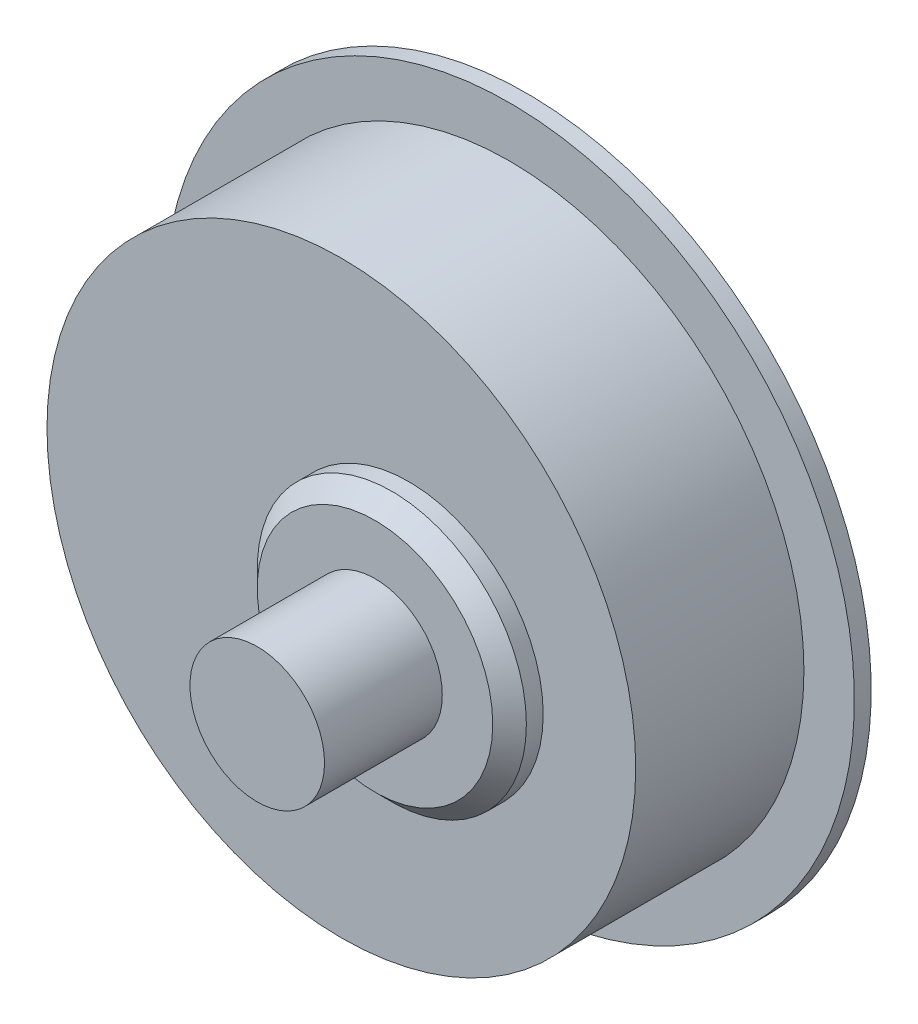
ISO-10303-21;
HEADER;
FILE_DESCRIPTION(('STEP AP214'),'2;1');
FILE_NAME('part.step','',(''),(''),'','','');
FILE_SCHEMA(('AUTOMOTIVE_DESIGN { 1 0 10303 214 1 1 1 1 }'));
ENDSEC;
DATA;
#1=APPLICATION_CONTEXT('core data for automotive mechanical design processes');
#2=APPLICATION_PROTOCOL_DEFINITION('international standard','automotive_design',2000,#1);
#3=PRODUCT_CONTEXT('',#1,'mechanical');
#4=PRODUCT('Part','Part','',(#3));
#5=PRODUCT_RELATED_PRODUCT_CATEGORY('part','',(#4));
#6=PRODUCT_DEFINITION_FORMATION('','',#4);
#7=PRODUCT_DEFINITION_CONTEXT('part definition',#1,'design');
#8=PRODUCT_DEFINITION('design','',#6,#7);
#9=PRODUCT_DEFINITION_SHAPE('','',#8);
#10=(LENGTH_UNIT() NAMED_UNIT(*) SI_UNIT(.MILLI.,.METRE.));
#11=(NAMED_UNIT(*) PLANE_ANGLE_UNIT() SI_UNIT($,.RADIAN.));
#12=(NAMED_UNIT(*) SI_UNIT($,.STERADIAN.) SOLID_ANGLE_UNIT());
#13=UNCERTAINTY_MEASURE_WITH_UNIT(LENGTH_MEASURE(1.E-05),#10,'distance_accuracy_value','');
#14=(GEOMETRIC_REPRESENTATION_CONTEXT(3) GLOBAL_UNCERTAINTY_ASSIGNED_CONTEXT((#13)) GLOBAL_UNIT_ASSIGNED_CONTEXT((#10,
#11,#12)) REPRESENTATION_CONTEXT('',''));
#15=CARTESIAN_POINT('',(0.,0.,0.));
#16=DIRECTION('',(0.,0.,1.));
#17=DIRECTION('',(1.,0.,0.));
#18=AXIS2_PLACEMENT_3D('',#15,#16,#17);
#19=CARTESIAN_POINT('',(0.,0.,5.));
#20=DIRECTION('',(0.,0.,-1.));
#21=DIRECTION('',(-1.,0.,0.));
#22=AXIS2_PLACEMENT_3D('',#19,#20,#21);
#23=CYLINDRICAL_SURFACE('',#22,4.);
#24=DIRECTION('',(0.,0.,-1.));
#25=VECTOR('',#24,1.);
#26=CARTESIAN_POINT('',(1.5,-3.70809924354783,5.));
#27=LINE('',#26,#25);
#28=CARTESIAN_POINT('',(1.5,-3.70809924354783,5.));
#29=VERTEX_POINT('',#28);
#30=CARTESIAN_POINT('',(1.5,-3.70809924354783,-6.5));
#31=VERTEX_POINT('',#30);
#32=EDGE_CURVE('E66',#29,#31,#27,.T.);
#33=ORIENTED_EDGE('',*,*,#32,.T.);
#34=CARTESIAN_POINT('',(0.,0.,-6.5));
#35=DIRECTION('',(0.,0.,-1.));
#36=DIRECTION('',(-1.,0.,0.));
#37=AXIS2_PLACEMENT_3D('',#34,#35,#36);
#38=CIRCLE('',#37,4.);
#39=CARTESIAN_POINT('',(1.5,3.70809924354783,-6.5));
#40=VERTEX_POINT('',#39);
#41=EDGE_CURVE('E101',#40,#31,#38,.F.);
#42=ORIENTED_EDGE('',*,*,#41,.F.);
#43=DIRECTION('',(0.,0.,-1.));
#44=VECTOR('',#43,1.);
#45=CARTESIAN_POINT('',(1.5,3.70809924354783,5.));
#46=LINE('',#45,#44);
#47=CARTESIAN_POINT('',(1.5,3.70809924354783,5.));
#48=VERTEX_POINT('',#47);
#49=EDGE_CURVE('E53',#48,#40,#46,.T.);
#50=ORIENTED_EDGE('',*,*,#49,.F.);
#51=CARTESIAN_POINT('',(0.,0.,5.));
#52=DIRECTION('',(0.,0.,1.));
#53=DIRECTION('',(1.,0.,0.));
#54=AXIS2_PLACEMENT_3D('',#51,#52,#53);
#55=CIRCLE('',#54,4.);
#56=EDGE_CURVE('E64',#48,#29,#55,.T.);
#57=ORIENTED_EDGE('',*,*,#56,.T.);
#58=EDGE_LOOP('',(#33,#42,#50,#57));
#59=FACE_BOUND('',#58,.T.);
#60=ADVANCED_FACE('F37',(#59),#23,.F.);
#61=CARTESIAN_POINT('',(1.5,0.,5.));
#62=DIRECTION('',(1.,0.,0.));
#63=DIRECTION('',(0.,0.,-1.));
#64=AXIS2_PLACEMENT_3D('',#61,#62,#63);
#65=PLANE('',#64);
#66=ORIENTED_EDGE('',*,*,#49,.T.);
#67=DIRECTION('',(0.,1.,0.));
#68=VECTOR('',#67,1.);
#69=CARTESIAN_POINT('',(1.5,0.,-6.5));
#70=LINE('',#69,#68);
#71=EDGE_CURVE('E73',#31,#40,#70,.T.);
#72=ORIENTED_EDGE('',*,*,#71,.F.);
#73=ORIENTED_EDGE('',*,*,#32,.F.);
#74=DIRECTION('',(0.,-1.,0.));
#75=VECTOR('',#74,1.);
#76=CARTESIAN_POINT('',(1.5,0.,5.));
#77=LINE('',#76,#75);
#78=EDGE_CURVE('E69',#48,#29,#77,.T.);
#79=ORIENTED_EDGE('',*,*,#78,.F.);
#80=EDGE_LOOP('',(#66,#72,#73,#79));
#81=FACE_BOUND('',#80,.T.);
#82=ADVANCED_FACE('F72',(#81),#65,.F.);
#83=CARTESIAN_POINT('',(-4.,0.,5.));
#84=DIRECTION('',(0.,0.,-1.));
#85=DIRECTION('',(-1.,0.,0.));
#86=AXIS2_PLACEMENT_3D('',#83,#84,#85);
#87=CYLINDRICAL_SURFACE('',#86,17.5);
#88=CARTESIAN_POINT('',(-4.,0.,5.));
#89=DIRECTION('',(0.,0.,1.));
#90=DIRECTION('',(1.,0.,0.));
#91=AXIS2_PLACEMENT_3D('',#88,#89,#90);
#92=CIRCLE('',#91,17.5);
#93=CARTESIAN_POINT('',(13.5,0.,5.));
#94=VERTEX_POINT('',#93);
#95=EDGE_CURVE('E75',#94,#94,#92,.T.);
#96=ORIENTED_EDGE('',*,*,#95,.F.);
#97=EDGE_LOOP('',(#96));
#98=FACE_BOUND('',#97,.T.);
#99=CARTESIAN_POINT('',(-4.,0.,-5.));
#100=DIRECTION('',(0.,0.,1.));
#101=DIRECTION('',(1.,0.,0.));
#102=AXIS2_PLACEMENT_3D('',#99,#100,#101);
#103=CIRCLE('',#102,17.5);
#104=CARTESIAN_POINT('',(13.5,0.,-5.));
#105=VERTEX_POINT('',#104);
#106=EDGE_CURVE('E70',#105,#105,#103,.T.);
#107=ORIENTED_EDGE('',*,*,#106,.T.);
#108=EDGE_LOOP('',(#107));
#109=FACE_BOUND('',#108,.T.);
#110=ADVANCED_FACE('F138',(#98,#109),#87,.T.);
#111=CARTESIAN_POINT('',(0.,0.,5.));
#112=DIRECTION('',(0.,0.,1.));
#113=DIRECTION('',(1.,0.,0.));
#114=AXIS2_PLACEMENT_3D('',#111,#112,#113);
#115=PLANE('',#114);
#116=CARTESIAN_POINT('',(0.,0.,5.));
#117=DIRECTION('',(0.,0.,1.));
#118=DIRECTION('',(1.,0.,0.));
#119=AXIS2_PLACEMENT_3D('',#116,#117,#118);
#120=CIRCLE('',#119,8.);
#121=CARTESIAN_POINT('',(8.,0.,5.));
#122=VERTEX_POINT('',#121);
#123=EDGE_CURVE('E97',#122,#122,#120,.T.);
#124=ORIENTED_EDGE('',*,*,#123,.F.);
#125=EDGE_LOOP('',(#124));
#126=FACE_BOUND('',#125,.T.);
#127=ORIENTED_EDGE('',*,*,#95,.T.);
#128=EDGE_LOOP('',(#127));
#129=FACE_BOUND('',#128,.T.);
#130=ADVANCED_FACE('F143',(#126,#129),#115,.T.);
#131=CARTESIAN_POINT('',(-4.,0.,-6.));
#132=DIRECTION('',(0.,0.,1.));
#133=DIRECTION('',(1.,0.,0.));
#134=AXIS2_PLACEMENT_3D('',#131,#132,#133);
#135=CYLINDRICAL_SURFACE('',#134,20.5);
#136=CARTESIAN_POINT('',(-4.,0.,-6.));
#137=DIRECTION('',(0.,0.,-1.));
#138=DIRECTION('',(-1.,0.,0.));
#139=AXIS2_PLACEMENT_3D('',#136,#137,#138);
#140=CIRCLE('',#139,20.5);
#141=CARTESIAN_POINT('',(-24.5,0.,-6.));
#142=VERTEX_POINT('',#141);
#143=EDGE_CURVE('E84',#142,#142,#140,.T.);
#144=ORIENTED_EDGE('',*,*,#143,.F.);
#145=EDGE_LOOP('',(#144));
#146=FACE_BOUND('',#145,.T.);
#147=CARTESIAN_POINT('',(-4.,0.,-5.));
#148=DIRECTION('',(0.,0.,-1.));
#149=DIRECTION('',(-1.,0.,0.));
#150=AXIS2_PLACEMENT_3D('',#147,#148,#149);
#151=CIRCLE('',#150,20.5);
#152=CARTESIAN_POINT('',(-24.5,0.,-5.));
#153=VERTEX_POINT('',#152);
#154=EDGE_CURVE('E107',#153,#153,#151,.T.);
#155=ORIENTED_EDGE('',*,*,#154,.T.);
#156=EDGE_LOOP('',(#155));
#157=FACE_BOUND('',#156,.T.);
#158=ADVANCED_FACE('F114',(#146,#157),#135,.T.);
#159=CARTESIAN_POINT('',(0.,0.,-6.));
#160=DIRECTION('',(0.,0.,-1.));
#161=DIRECTION('',(-1.,0.,0.));
#162=AXIS2_PLACEMENT_3D('',#159,#160,#161);
#163=PLANE('',#162);
#164=CARTESIAN_POINT('',(0.,0.,-6.));
#165=DIRECTION('',(0.,0.,-1.));
#166=DIRECTION('',(-1.,0.,0.));
#167=AXIS2_PLACEMENT_3D('',#164,#165,#166);
#168=CIRCLE('',#167,7.5);
#169=CARTESIAN_POINT('',(-7.5,0.,-6.));
#170=VERTEX_POINT('',#169);
#171=EDGE_CURVE('E100',#170,#170,#168,.T.);
#172=ORIENTED_EDGE('',*,*,#171,.F.);
#173=EDGE_LOOP('',(#172));
#174=FACE_BOUND('',#173,.T.);
#175=ORIENTED_EDGE('',*,*,#143,.T.);
#176=EDGE_LOOP('',(#175));
#177=FACE_BOUND('',#176,.T.);
#178=ADVANCED_FACE('F119',(#174,#177),#163,.T.);
#179=CARTESIAN_POINT('',(0.,0.,-5.));
#180=DIRECTION('',(0.,0.,-1.));
#181=DIRECTION('',(-1.,0.,0.));
#182=AXIS2_PLACEMENT_3D('',#179,#180,#181);
#183=PLANE('',#182);
#184=ORIENTED_EDGE('',*,*,#106,.F.);
#185=EDGE_LOOP('',(#184));
#186=FACE_BOUND('',#185,.T.);
#187=ORIENTED_EDGE('',*,*,#154,.F.);
#188=EDGE_LOOP('',(#187));
#189=FACE_BOUND('',#188,.T.);
#190=ADVANCED_FACE('F116',(#186,#189),#183,.F.);
#191=CARTESIAN_POINT('',(0.,0.,-6.5));
#192=DIRECTION('',(0.,0.,1.));
#193=DIRECTION('',(1.,0.,0.));
#194=AXIS2_PLACEMENT_3D('',#191,#192,#193);
#195=CYLINDRICAL_SURFACE('',#194,7.5);
#196=CARTESIAN_POINT('',(0.,0.,-6.5));
#197=DIRECTION('',(0.,0.,-1.));
#198=DIRECTION('',(-1.,0.,0.));
#199=AXIS2_PLACEMENT_3D('',#196,#197,#198);
#200=CIRCLE('',#199,7.5);
#201=CARTESIAN_POINT('',(-7.5,0.,-6.5));
#202=VERTEX_POINT('',#201);
#203=EDGE_CURVE('E104',#202,#202,#200,.T.);
#204=ORIENTED_EDGE('',*,*,#203,.F.);
#205=EDGE_LOOP('',(#204));
#206=FACE_BOUND('',#205,.T.);
#207=ORIENTED_EDGE('',*,*,#171,.T.);
#208=EDGE_LOOP('',(#207));
#209=FACE_BOUND('',#208,.T.);
#210=ADVANCED_FACE('F118',(#206,#209),#195,.T.);
#211=CARTESIAN_POINT('',(0.,0.,-6.5));
#212=DIRECTION('',(0.,0.,-1.));
#213=DIRECTION('',(-1.,0.,0.));
#214=AXIS2_PLACEMENT_3D('',#211,#212,#213);
#215=PLANE('',#214);
#216=ORIENTED_EDGE('',*,*,#41,.T.);
#217=ORIENTED_EDGE('',*,*,#71,.T.);
#218=EDGE_LOOP('',(#216,#217));
#219=FACE_BOUND('',#218,.T.);
#220=ORIENTED_EDGE('',*,*,#203,.T.);
#221=EDGE_LOOP('',(#220));
#222=FACE_BOUND('',#221,.T.);
#223=ADVANCED_FACE('F126',(#219,#222),#215,.T.);
#224=CARTESIAN_POINT('',(0.,0.,7.));
#225=DIRECTION('',(0.,0.,1.));
#226=DIRECTION('',(1.,0.,0.));
#227=AXIS2_PLACEMENT_3D('',#224,#225,#226);
#228=PLANE('',#227);
#229=CARTESIAN_POINT('',(0.,0.,7.));
#230=DIRECTION('',(0.,0.,1.));
#231=DIRECTION('',(1.,0.,0.));
#232=AXIS2_PLACEMENT_3D('',#229,#230,#231);
#233=CIRCLE('',#232,6.99999999999999);
#234=CARTESIAN_POINT('',(6.99999999999999,0.,7.));
#235=VERTEX_POINT('',#234);
#236=EDGE_CURVE('E46',#235,#235,#233,.T.);
#237=ORIENTED_EDGE('',*,*,#236,.T.);
#238=EDGE_LOOP('',(#237));
#239=FACE_BOUND('',#238,.T.);
#240=CARTESIAN_POINT('',(0.,0.,7.));
#241=DIRECTION('',(0.,0.,1.));
#242=DIRECTION('',(1.,0.,0.));
#243=AXIS2_PLACEMENT_3D('',#240,#241,#242);
#244=CIRCLE('',#243,4.);
#245=CARTESIAN_POINT('',(4.,0.,7.));
#246=VERTEX_POINT('',#245);
#247=EDGE_CURVE('E86',#246,#246,#244,.T.);
#248=ORIENTED_EDGE('',*,*,#247,.F.);
#249=EDGE_LOOP('',(#248));
#250=FACE_BOUND('',#249,.T.);
#251=ADVANCED_FACE('F178',(#239,#250),#228,.T.);
#252=CARTESIAN_POINT('',(0.,0.,7.));
#253=DIRECTION('',(0.,0.,-1.));
#254=DIRECTION('',(-1.,0.,0.));
#255=AXIS2_PLACEMENT_3D('',#252,#253,#254);
#256=CYLINDRICAL_SURFACE('',#255,8.);
#257=CARTESIAN_POINT('',(0.,0.,5.99999999999999));
#258=DIRECTION('',(0.,0.,1.));
#259=DIRECTION('',(1.,0.,0.));
#260=AXIS2_PLACEMENT_3D('',#257,#258,#259);
#261=CIRCLE('',#260,8.);
#262=CARTESIAN_POINT('',(8.,0.,5.99999999999999));
#263=VERTEX_POINT('',#262);
#264=EDGE_CURVE('E11',#263,#263,#261,.F.);
#265=ORIENTED_EDGE('',*,*,#264,.T.);
#266=EDGE_LOOP('',(#265));
#267=FACE_BOUND('',#266,.T.);
#268=ORIENTED_EDGE('',*,*,#123,.T.);
#269=EDGE_LOOP('',(#268));
#270=FACE_BOUND('',#269,.T.);
#271=ADVANCED_FACE('F189',(#267,#270),#256,.T.);
#272=CARTESIAN_POINT('',(0.,0.,5.));
#273=DIRECTION('',(0.,0.,1.));
#274=DIRECTION('',(1.,0.,0.));
#275=AXIS2_PLACEMENT_3D('',#272,#273,#274);
#276=PLANE('',#275);
#277=ORIENTED_EDGE('',*,*,#56,.F.);
#278=ORIENTED_EDGE('',*,*,#78,.T.);
#279=EDGE_LOOP('',(#277,#278));
#280=FACE_BOUND('',#279,.T.);
#281=ADVANCED_FACE('F77',(#280),#276,.F.);
#282=CARTESIAN_POINT('',(0.,0.,14.));
#283=DIRECTION('',(0.,0.,-1.));
#284=DIRECTION('',(-1.,0.,0.));
#285=AXIS2_PLACEMENT_3D('',#282,#283,#284);
#286=CYLINDRICAL_SURFACE('',#285,4.);
#287=CARTESIAN_POINT('',(0.,0.,14.));
#288=DIRECTION('',(0.,0.,1.));
#289=DIRECTION('',(1.,0.,0.));
#290=AXIS2_PLACEMENT_3D('',#287,#288,#289);
#291=CIRCLE('',#290,4.);
#292=CARTESIAN_POINT('',(4.,0.,14.));
#293=VERTEX_POINT('',#292);
#294=EDGE_CURVE('E96',#293,#293,#291,.T.);
#295=ORIENTED_EDGE('',*,*,#294,.F.);
#296=EDGE_LOOP('',(#295));
#297=FACE_BOUND('',#296,.T.);
#298=ORIENTED_EDGE('',*,*,#247,.T.);
#299=EDGE_LOOP('',(#298));
#300=FACE_BOUND('',#299,.T.);
#301=ADVANCED_FACE('F204',(#297,#300),#286,.T.);
#302=CARTESIAN_POINT('',(0.,0.,14.));
#303=DIRECTION('',(0.,0.,1.));
#304=DIRECTION('',(1.,0.,0.));
#305=AXIS2_PLACEMENT_3D('',#302,#303,#304);
#306=PLANE('',#305);
#307=ORIENTED_EDGE('',*,*,#294,.T.);
#308=EDGE_LOOP('',(#307));
#309=FACE_BOUND('',#308,.T.);
#310=ADVANCED_FACE('F211',(#309),#306,.T.);
#311=CARTESIAN_POINT('',(0.,0.,7.));
#312=DIRECTION('',(0.,0.,-1.));
#313=DIRECTION('',(-1.,0.,0.));
#314=AXIS2_PLACEMENT_3D('',#311,#312,#313);
#315=CONICAL_SURFACE('',#314,6.99999999999999,0.785398163397448);
#316=ORIENTED_EDGE('',*,*,#264,.F.);
#317=EDGE_LOOP('',(#316));
#318=FACE_BOUND('',#317,.T.);
#319=ORIENTED_EDGE('',*,*,#236,.F.);
#320=EDGE_LOOP('',(#319));
#321=FACE_BOUND('',#320,.T.);
#322=ADVANCED_FACE('F40',(#318,#321),#315,.T.);
#323=CLOSED_SHELL('',(#60,#82,#110,#130,#158,#178,#190,#210,#223,#251,#271,#281,#301,#310,#322));
#324=MANIFOLD_SOLID_BREP('B2',#323);
#325=ADVANCED_BREP_SHAPE_REPRESENTATION('',(#18,#324),#14);
#326=SHAPE_DEFINITION_REPRESENTATION(#9,#325);
ENDSEC;
END-ISO-10303-21;
